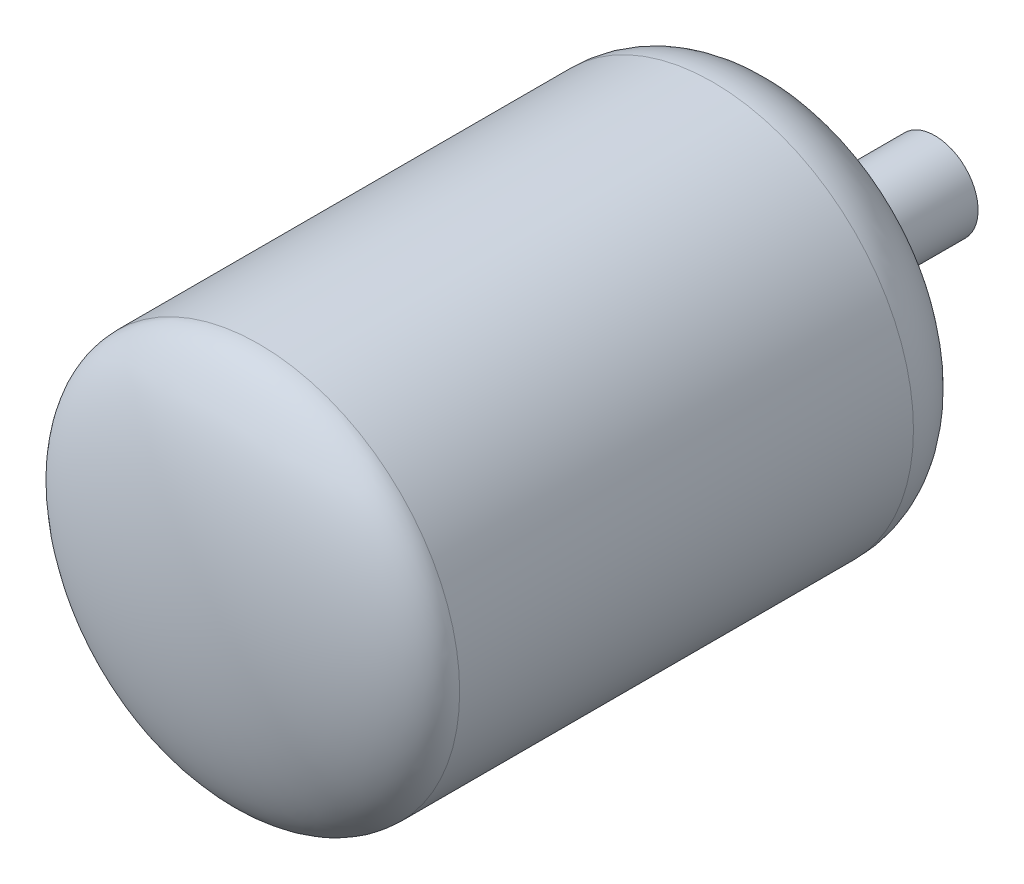
ISO-10303-21;
HEADER;
FILE_DESCRIPTION(('STEP AP214'),'2;1');
FILE_NAME('part.step','',(''),(''),'','','');
FILE_SCHEMA(('AUTOMOTIVE_DESIGN { 1 0 10303 214 1 1 1 1 }'));
ENDSEC;
DATA;
#1=APPLICATION_CONTEXT('core data for automotive mechanical design processes');
#2=APPLICATION_PROTOCOL_DEFINITION('international standard','automotive_design',2000,#1);
#3=PRODUCT_CONTEXT('',#1,'mechanical');
#4=PRODUCT('Part','Part','',(#3));
#5=PRODUCT_RELATED_PRODUCT_CATEGORY('part','',(#4));
#6=PRODUCT_DEFINITION_FORMATION('','',#4);
#7=PRODUCT_DEFINITION_CONTEXT('part definition',#1,'design');
#8=PRODUCT_DEFINITION('design','',#6,#7);
#9=PRODUCT_DEFINITION_SHAPE('','',#8);
#10=(LENGTH_UNIT() NAMED_UNIT(*) SI_UNIT(.MILLI.,.METRE.));
#11=(NAMED_UNIT(*) PLANE_ANGLE_UNIT() SI_UNIT($,.RADIAN.));
#12=(NAMED_UNIT(*) SI_UNIT($,.STERADIAN.) SOLID_ANGLE_UNIT());
#13=UNCERTAINTY_MEASURE_WITH_UNIT(LENGTH_MEASURE(1.E-05),#10,'distance_accuracy_value','');
#14=(GEOMETRIC_REPRESENTATION_CONTEXT(3) GLOBAL_UNCERTAINTY_ASSIGNED_CONTEXT((#13)) GLOBAL_UNIT_ASSIGNED_CONTEXT((#10,
#11,#12)) REPRESENTATION_CONTEXT('',''));
#15=CARTESIAN_POINT('',(0.,0.,0.));
#16=DIRECTION('',(0.,0.,1.));
#17=DIRECTION('',(1.,0.,0.));
#18=AXIS2_PLACEMENT_3D('',#15,#16,#17);
#19=CARTESIAN_POINT('',(0.,0.,188.28));
#20=DIRECTION('',(1.,0.,0.));
#21=DIRECTION('',(0.,1.,0.));
#22=AXIS2_PLACEMENT_3D('',#19,#20,#21);
#23=ELLIPSE('',#22,55.88,20.);
#24=TRIMMED_CURVE('',#23,(PARAMETER_VALUE(-1.5707963267949)),(PARAMETER_VALUE(1.5707963267949)),
.T.,.PARAMETER.);
#25=CARTESIAN_POINT('',(0.,0.,0.));
#26=DIRECTION('',(0.,0.,-1.));
#27=AXIS1_PLACEMENT('',#25,#26);
#28=SURFACE_OF_REVOLUTION('',#24,#27);
#29=CARTESIAN_POINT('',(0.,0.,208.28));
#30=VERTEX_POINT('',#29);
#31=VERTEX_LOOP('',#30);
#32=FACE_BOUND('',#31,.T.);
#33=CARTESIAN_POINT('',(0.,0.,188.28));
#34=DIRECTION('',(0.,0.,-1.));
#35=DIRECTION('',(-1.,0.,0.));
#36=AXIS2_PLACEMENT_3D('',#33,#34,#35);
#37=CIRCLE('',#36,55.88);
#38=CARTESIAN_POINT('',(-55.88,0.,188.28));
#39=VERTEX_POINT('',#38);
#40=EDGE_CURVE('E11',#39,#39,#37,.T.);
#41=ORIENTED_EDGE('',*,*,#40,.F.);
#42=EDGE_LOOP('',(#41));
#43=FACE_BOUND('',#42,.T.);
#44=ADVANCED_FACE('F43',(#32,#43),#28,.F.);
#45=CARTESIAN_POINT('',(0.,0.,0.));
#46=DIRECTION('',(0.,0.,-1.));
#47=DIRECTION('',(-1.,0.,0.));
#48=AXIS2_PLACEMENT_3D('',#45,#46,#47);
#49=CYLINDRICAL_SURFACE('',#48,55.88);
#50=ORIENTED_EDGE('',*,*,#40,.T.);
#51=EDGE_LOOP('',(#50));
#52=FACE_BOUND('',#51,.T.);
#53=CARTESIAN_POINT('',(0.,0.,61.8811351958332));
#54=DIRECTION('',(0.,0.,-1.));
#55=DIRECTION('',(-1.,0.,0.));
#56=AXIS2_PLACEMENT_3D('',#53,#54,#55);
#57=CIRCLE('',#56,55.88);
#58=CARTESIAN_POINT('',(-55.88,0.,61.8811351958332));
#59=VERTEX_POINT('',#58);
#60=EDGE_CURVE('E49',#59,#59,#57,.T.);
#61=ORIENTED_EDGE('',*,*,#60,.F.);
#62=EDGE_LOOP('',(#61));
#63=FACE_BOUND('',#62,.T.);
#64=ADVANCED_FACE('F54',(#52,#63),#49,.T.);
#65=CARTESIAN_POINT('',(0.,0.,61.8811351958332));
#66=DIRECTION('',(0.,0.,-1.));
#67=DIRECTION('',(-1.,0.,0.));
#68=AXIS2_PLACEMENT_3D('',#65,#66,#67);
#69=TOROIDAL_SURFACE('',#68,35.88,20.);
#70=ORIENTED_EDGE('',*,*,#60,.T.);
#71=EDGE_LOOP('',(#70));
#72=FACE_BOUND('',#71,.T.);
#73=CARTESIAN_POINT('',(0.,0.,44.5606271201444));
#74=DIRECTION('',(0.,0.,-1.));
#75=DIRECTION('',(-1.,0.,0.));
#76=AXIS2_PLACEMENT_3D('',#73,#74,#75);
#77=CIRCLE('',#76,45.88);
#78=CARTESIAN_POINT('',(45.88,0.,44.5606271201444));
#79=VERTEX_POINT('',#78);
#80=EDGE_CURVE('E63',#79,#79,#77,.T.);
#81=ORIENTED_EDGE('',*,*,#80,.F.);
#82=EDGE_LOOP('',(#81));
#83=FACE_BOUND('',#82,.T.);
#84=ADVANCED_FACE('F58',(#72,#83),#69,.T.);
#85=CARTESIAN_POINT('',(0.,0.,25.));
#86=DIRECTION('',(0.,0.,1.));
#87=DIRECTION('',(1.,0.,0.));
#88=AXIS2_PLACEMENT_3D('',#85,#86,#87);
#89=CONICAL_SURFACE('',#88,12.,1.0471975511966);
#90=CARTESIAN_POINT('',(0.,0.,25.));
#91=DIRECTION('',(0.,0.,-1.));
#92=DIRECTION('',(-1.,0.,0.));
#93=AXIS2_PLACEMENT_3D('',#90,#91,#92);
#94=CIRCLE('',#93,12.);
#95=CARTESIAN_POINT('',(12.,0.,25.));
#96=VERTEX_POINT('',#95);
#97=EDGE_CURVE('E67',#96,#96,#94,.T.);
#98=CARTESIAN_POINT('',(45.88,0.,44.5606271201444));
#99=CARTESIAN_POINT('',(45.5270833333333,0.,44.3568705876429));
#100=CARTESIAN_POINT('',(45.1741666666666,0.,44.1531140551414));
#101=CARTESIAN_POINT('',(44.4683333333333,0.,43.7456009901384));
#102=CARTESIAN_POINT('',(44.1154166666666,0.,43.5418444576369));
#103=CARTESIAN_POINT('',(43.4095833333333,0.,43.1343313926339));
#104=CARTESIAN_POINT('',(43.0566666666666,0.,42.9305748601324));
#105=CARTESIAN_POINT('',(42.3508333333333,0.,42.5230617951294));
#106=CARTESIAN_POINT('',(41.9979166666666,0.,42.3193052626278));
#107=CARTESIAN_POINT('',(41.2920833333333,0.,41.9117921976248));
#108=CARTESIAN_POINT('',(40.9391666666666,0.,41.7080356651233));
#109=CARTESIAN_POINT('',(40.2333333333333,0.,41.3005226001203));
#110=CARTESIAN_POINT('',(39.8804166666666,0.,41.0967660676188));
#111=CARTESIAN_POINT('',(39.1745833333333,0.,40.6892530026158));
#112=CARTESIAN_POINT('',(38.8216666666666,0.,40.4854964701143));
#113=CARTESIAN_POINT('',(38.1158333333333,0.,40.0779834051113));
#114=CARTESIAN_POINT('',(37.7629166666666,0.,39.8742268726098));
#115=CARTESIAN_POINT('',(37.0570833333333,0.,39.4667138076068));
#116=CARTESIAN_POINT('',(36.7041666666666,0.,39.2629572751053));
#117=CARTESIAN_POINT('',(35.9983333333333,0.,38.8554442101023));
#118=CARTESIAN_POINT('',(35.6454166666666,0.,38.6516876776008));
#119=CARTESIAN_POINT('',(34.9395833333333,0.,38.2441746125978));
#120=CARTESIAN_POINT('',(34.5866666666666,0.,38.0404180800963));
#121=CARTESIAN_POINT('',(33.8808333333333,0.,37.6329050150933));
#122=CARTESIAN_POINT('',(33.5279166666666,0.,37.4291484825917));
#123=CARTESIAN_POINT('',(32.8220833333333,0.,37.0216354175887));
#124=CARTESIAN_POINT('',(32.4691666666666,0.,36.8178788850872));
#125=CARTESIAN_POINT('',(31.7633333333333,0.,36.4103658200842));
#126=CARTESIAN_POINT('',(31.4104166666666,0.,36.2066092875827));
#127=CARTESIAN_POINT('',(30.7045833333333,0.,35.7990962225797));
#128=CARTESIAN_POINT('',(30.3516666666666,0.,35.5953396900782));
#129=CARTESIAN_POINT('',(29.6458333333333,0.,35.1878266250752));
#130=CARTESIAN_POINT('',(29.2929166666667,0.,34.9840700925737));
#131=CARTESIAN_POINT('',(28.5870833333333,0.,34.5765570275707));
#132=CARTESIAN_POINT('',(28.2341666666666,0.,34.3728004950692));
#133=CARTESIAN_POINT('',(27.5283333333333,0.,33.9652874300662));
#134=CARTESIAN_POINT('',(27.1754166666666,0.,33.7615308975647));
#135=CARTESIAN_POINT('',(26.4695833333333,0.,33.3540178325617));
#136=CARTESIAN_POINT('',(26.1166666666667,0.,33.1502613000602));
#137=CARTESIAN_POINT('',(25.4108333333333,0.,32.7427482350572));
#138=CARTESIAN_POINT('',(25.0579166666667,0.,32.5389917025557));
#139=CARTESIAN_POINT('',(24.3520833333333,0.,32.1314786375526));
#140=CARTESIAN_POINT('',(23.9991666666667,0.,31.9277221050511));
#141=CARTESIAN_POINT('',(23.2933333333333,0.,31.5202090400481));
#142=CARTESIAN_POINT('',(22.9404166666667,0.,31.3164525075466));
#143=CARTESIAN_POINT('',(22.2345833333333,0.,30.9089394425436));
#144=CARTESIAN_POINT('',(21.8816666666667,0.,30.7051829100421));
#145=CARTESIAN_POINT('',(21.1758333333333,0.,30.2976698450391));
#146=CARTESIAN_POINT('',(20.8229166666667,0.,30.0939133125376));
#147=CARTESIAN_POINT('',(20.1170833333333,0.,29.6864002475346));
#148=CARTESIAN_POINT('',(19.7641666666667,0.,29.4826437150331));
#149=CARTESIAN_POINT('',(19.0583333333333,0.,29.0751306500301));
#150=CARTESIAN_POINT('',(18.7054166666667,0.,28.8713741175286));
#151=CARTESIAN_POINT('',(17.9995833333333,0.,28.4638610525256));
#152=CARTESIAN_POINT('',(17.6466666666667,0.,28.2601045200241));
#153=CARTESIAN_POINT('',(16.9408333333333,0.,27.8525914550211));
#154=CARTESIAN_POINT('',(16.5879166666667,0.,27.6488349225196));
#155=CARTESIAN_POINT('',(15.8820833333333,0.,27.2413218575165));
#156=CARTESIAN_POINT('',(15.5291666666667,0.,27.037565325015));
#157=CARTESIAN_POINT('',(14.8233333333333,0.,26.630052260012));
#158=CARTESIAN_POINT('',(14.4704166666667,0.,26.4262957275105));
#159=CARTESIAN_POINT('',(13.7645833333333,0.,26.0187826625075));
#160=CARTESIAN_POINT('',(13.4116666666667,0.,25.815026130006));
#161=CARTESIAN_POINT('',(12.7058333333333,0.,25.407513065003));
#162=CARTESIAN_POINT('',(12.3529166666667,0.,25.2037565325015));
#163=CARTESIAN_POINT('',(12.,0.,25.));
#164=B_SPLINE_CURVE_WITH_KNOTS('',3,(#98,#99,#100,#101,#102,#103,#104,#105,#106,#107,#108,#109,
#110,#111,#112,#113,#114,#115,#116,#117,#118,#119,#120,#121,#122,#123,#124,#125,#126,#127,#128,
#129,#130,#131,#132,#133,#134,#135,#136,#137,#138,#139,#140,#141,#142,#143,#144,#145,#146,#147,
#148,#149,#150,#151,#152,#153,#154,#155,#156,#157,#158,#159,#160,#161,#162,#163),.UNSPECIFIED.,
.F.,.F.,(4,2,2,2,2,2,2,2,2,2,2,2,2,2,2,2,2,2,2,2,2,2,2,2,2,2,2,2,2,2,2,2,4),(0.,
1.22253919500904,2.44507839001807,3.6676175850271,4.89015678003612,6.11269597504515,
7.33523517005418,8.55777436506321,9.78031356007224,11.0028527550813,12.2253919500903,
13.4479311450993,14.6704703401084,15.8930095351174,17.1155487301264,18.3380879251354,
19.5606271201445,20.7831663151535,22.0057055101625,23.2282447051716,24.4507839001806,
25.6733230951896,26.8958622901987,28.1184014852077,29.3409406802167,30.5634798752257,
31.7860190702348,33.0085582652438,34.2310974602528,35.4536366552619,36.6761758502709,
37.8987150452799,39.1212542402889),.UNSPECIFIED.);
#165=EDGE_CURVE('BSEAM79',#79,#96,#164,.T.);
#166=ORIENTED_EDGE('',*,*,#80,.T.);
#167=ORIENTED_EDGE('',*,*,#97,.F.);
#168=ORIENTED_EDGE('',*,*,#165,.T.);
#169=ORIENTED_EDGE('',*,*,#165,.F.);
#170=EDGE_LOOP('',(#166,#168,#167,#169));
#171=FACE_BOUND('',#170,.T.);
#172=ADVANCED_FACE('F79',(#171),#89,.T.);
#173=CARTESIAN_POINT('',(0.,0.,0.));
#174=DIRECTION('',(0.,0.,-1.));
#175=DIRECTION('',(-1.,0.,0.));
#176=AXIS2_PLACEMENT_3D('',#173,#174,#175);
#177=CYLINDRICAL_SURFACE('',#176,12.);
#178=ORIENTED_EDGE('',*,*,#97,.T.);
#179=EDGE_LOOP('',(#178));
#180=FACE_BOUND('',#179,.T.);
#181=CARTESIAN_POINT('',(0.,0.,0.));
#182=DIRECTION('',(0.,0.,-1.));
#183=DIRECTION('',(-1.,0.,0.));
#184=AXIS2_PLACEMENT_3D('',#181,#182,#183);
#185=CIRCLE('',#184,12.);
#186=CARTESIAN_POINT('',(-12.,0.,0.));
#187=VERTEX_POINT('',#186);
#188=EDGE_CURVE('E71',#187,#187,#185,.T.);
#189=ORIENTED_EDGE('',*,*,#188,.F.);
#190=EDGE_LOOP('',(#189));
#191=FACE_BOUND('',#190,.T.);
#192=ADVANCED_FACE('F76',(#180,#191),#177,.T.);
#193=CARTESIAN_POINT('',(0.,0.,0.));
#194=DIRECTION('',(0.,0.,-1.));
#195=DIRECTION('',(-1.,0.,0.));
#196=AXIS2_PLACEMENT_3D('',#193,#194,#195);
#197=PLANE('',#196);
#198=ORIENTED_EDGE('',*,*,#188,.T.);
#199=EDGE_LOOP('',(#198));
#200=FACE_BOUND('',#199,.T.);
#201=ADVANCED_FACE('F78',(#200),#197,.T.);
#202=CLOSED_SHELL('',(#44,#64,#84,#172,#192,#201));
#203=MANIFOLD_SOLID_BREP('B2',#202);
#204=ADVANCED_BREP_SHAPE_REPRESENTATION('',(#18,#203),#14);
#205=SHAPE_DEFINITION_REPRESENTATION(#9,#204);
ENDSEC;
END-ISO-10303-21;
